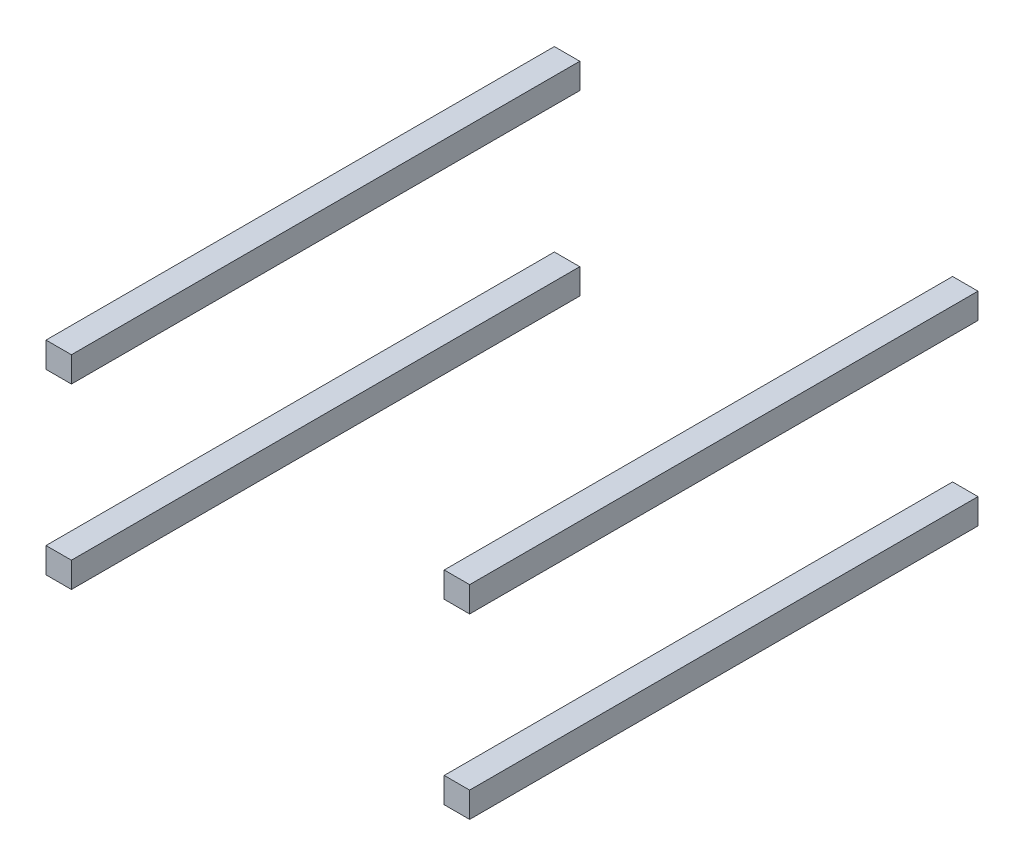
ISO-10303-21;
HEADER;
FILE_DESCRIPTION(('STEP AP214'),'2;1');
FILE_NAME('part.step','',(''),(''),'','','');
FILE_SCHEMA(('AUTOMOTIVE_DESIGN { 1 0 10303 214 1 1 1 1 }'));
ENDSEC;
DATA;
#1=APPLICATION_CONTEXT('core data for automotive mechanical design processes');
#2=APPLICATION_PROTOCOL_DEFINITION('international standard','automotive_design',2000,#1);
#3=PRODUCT_CONTEXT('',#1,'mechanical');
#4=PRODUCT('Part','Part','',(#3));
#5=PRODUCT_RELATED_PRODUCT_CATEGORY('part','',(#4));
#6=PRODUCT_DEFINITION_FORMATION('','',#4);
#7=PRODUCT_DEFINITION_CONTEXT('part definition',#1,'design');
#8=PRODUCT_DEFINITION('design','',#6,#7);
#9=PRODUCT_DEFINITION_SHAPE('','',#8);
#10=(LENGTH_UNIT() NAMED_UNIT(*) SI_UNIT(.MILLI.,.METRE.));
#11=(NAMED_UNIT(*) PLANE_ANGLE_UNIT() SI_UNIT($,.RADIAN.));
#12=(NAMED_UNIT(*) SI_UNIT($,.STERADIAN.) SOLID_ANGLE_UNIT());
#13=UNCERTAINTY_MEASURE_WITH_UNIT(LENGTH_MEASURE(1.E-05),#10,'distance_accuracy_value','');
#14=(GEOMETRIC_REPRESENTATION_CONTEXT(3) GLOBAL_UNCERTAINTY_ASSIGNED_CONTEXT((#13)) GLOBAL_UNIT_ASSIGNED_CONTEXT((#10,
#11,#12)) REPRESENTATION_CONTEXT('',''));
#15=CARTESIAN_POINT('',(0.,0.,0.));
#16=DIRECTION('',(0.,0.,1.));
#17=DIRECTION('',(1.,0.,0.));
#18=AXIS2_PLACEMENT_3D('',#15,#16,#17);
#19=CARTESIAN_POINT('',(-447.698412698413,45.5807916395078,600.));
#20=DIRECTION('',(1.,0.,0.));
#21=DIRECTION('',(0.,0.,-1.));
#22=AXIS2_PLACEMENT_3D('',#19,#20,#21);
#23=PLANE('',#22);
#24=DIRECTION('',(0.,-1.,0.));
#25=VECTOR('',#24,1.);
#26=CARTESIAN_POINT('',(-447.698412698413,45.5807916395078,0.));
#27=LINE('',#26,#25);
#28=CARTESIAN_POINT('',(-447.698412698413,45.5807916395078,0.));
#29=VERTEX_POINT('',#28);
#30=CARTESIAN_POINT('',(-447.698412698413,15.5807916395078,0.));
#31=VERTEX_POINT('',#30);
#32=EDGE_CURVE('E12',#29,#31,#27,.T.);
#33=ORIENTED_EDGE('',*,*,#32,.T.);
#34=DIRECTION('',(0.,0.,-1.));
#35=VECTOR('',#34,1.);
#36=CARTESIAN_POINT('',(-447.698412698413,15.5807916395078,600.));
#37=LINE('',#36,#35);
#38=CARTESIAN_POINT('',(-447.698412698413,15.5807916395078,600.));
#39=VERTEX_POINT('',#38);
#40=EDGE_CURVE('E136',#39,#31,#37,.T.);
#41=ORIENTED_EDGE('',*,*,#40,.F.);
#42=DIRECTION('',(0.,-1.,0.));
#43=VECTOR('',#42,1.);
#44=CARTESIAN_POINT('',(-447.698412698413,45.5807916395078,600.));
#45=LINE('',#44,#43);
#46=CARTESIAN_POINT('',(-447.698412698413,45.5807916395078,600.));
#47=VERTEX_POINT('',#46);
#48=EDGE_CURVE('E58',#47,#39,#45,.T.);
#49=ORIENTED_EDGE('',*,*,#48,.F.);
#50=DIRECTION('',(0.,0.,-1.));
#51=VECTOR('',#50,1.);
#52=CARTESIAN_POINT('',(-447.698412698413,45.5807916395078,600.));
#53=LINE('',#52,#51);
#54=EDGE_CURVE('E99',#47,#29,#53,.T.);
#55=ORIENTED_EDGE('',*,*,#54,.T.);
#56=EDGE_LOOP('',(#33,#41,#49,#55));
#57=FACE_BOUND('',#56,.T.);
#58=ADVANCED_FACE('F54',(#57),#23,.F.);
#59=CARTESIAN_POINT('',(-447.698412698413,15.5807916395078,600.));
#60=DIRECTION('',(0.,1.,0.));
#61=DIRECTION('',(-1.,0.,0.));
#62=AXIS2_PLACEMENT_3D('',#59,#60,#61);
#63=PLANE('',#62);
#64=DIRECTION('',(1.,0.,0.));
#65=VECTOR('',#64,1.);
#66=CARTESIAN_POINT('',(-447.698412698413,15.5807916395078,0.));
#67=LINE('',#66,#65);
#68=CARTESIAN_POINT('',(-417.698412698413,15.5807916395079,0.));
#69=VERTEX_POINT('',#68);
#70=EDGE_CURVE('E65',#31,#69,#67,.T.);
#71=ORIENTED_EDGE('',*,*,#70,.T.);
#72=DIRECTION('',(0.,0.,-1.));
#73=VECTOR('',#72,1.);
#74=CARTESIAN_POINT('',(-417.698412698413,15.5807916395079,600.));
#75=LINE('',#74,#73);
#76=CARTESIAN_POINT('',(-417.698412698413,15.5807916395079,600.));
#77=VERTEX_POINT('',#76);
#78=EDGE_CURVE('E114',#77,#69,#75,.T.);
#79=ORIENTED_EDGE('',*,*,#78,.F.);
#80=DIRECTION('',(1.,0.,0.));
#81=VECTOR('',#80,1.);
#82=CARTESIAN_POINT('',(-447.698412698413,15.5807916395078,600.));
#83=LINE('',#82,#81);
#84=EDGE_CURVE('E91',#39,#77,#83,.T.);
#85=ORIENTED_EDGE('',*,*,#84,.F.);
#86=ORIENTED_EDGE('',*,*,#40,.T.);
#87=EDGE_LOOP('',(#71,#79,#85,#86));
#88=FACE_BOUND('',#87,.T.);
#89=ADVANCED_FACE('F140',(#88),#63,.F.);
#90=CARTESIAN_POINT('',(-417.698412698413,45.5807916395079,600.));
#91=DIRECTION('',(1.,0.,0.));
#92=DIRECTION('',(0.,0.,-1.));
#93=AXIS2_PLACEMENT_3D('',#90,#91,#92);
#94=PLANE('',#93);
#95=DIRECTION('',(0.,-1.,0.));
#96=VECTOR('',#95,1.);
#97=CARTESIAN_POINT('',(-417.698412698413,45.5807916395079,0.));
#98=LINE('',#97,#96);
#99=CARTESIAN_POINT('',(-417.698412698413,45.5807916395079,0.));
#100=VERTEX_POINT('',#99);
#101=EDGE_CURVE('E116',#100,#69,#98,.T.);
#102=ORIENTED_EDGE('',*,*,#101,.F.);
#103=DIRECTION('',(0.,0.,-1.));
#104=VECTOR('',#103,1.);
#105=CARTESIAN_POINT('',(-417.698412698413,45.5807916395079,600.));
#106=LINE('',#105,#104);
#107=CARTESIAN_POINT('',(-417.698412698413,45.5807916395079,600.));
#108=VERTEX_POINT('',#107);
#109=EDGE_CURVE('E104',#108,#100,#106,.T.);
#110=ORIENTED_EDGE('',*,*,#109,.F.);
#111=DIRECTION('',(0.,-1.,0.));
#112=VECTOR('',#111,1.);
#113=CARTESIAN_POINT('',(-417.698412698413,45.5807916395079,600.));
#114=LINE('',#113,#112);
#115=EDGE_CURVE('E130',#108,#77,#114,.T.);
#116=ORIENTED_EDGE('',*,*,#115,.T.);
#117=ORIENTED_EDGE('',*,*,#78,.T.);
#118=EDGE_LOOP('',(#102,#110,#116,#117));
#119=FACE_BOUND('',#118,.T.);
#120=ADVANCED_FACE('F117',(#119),#94,.T.);
#121=CARTESIAN_POINT('',(-447.698412698413,45.5807916395078,600.));
#122=DIRECTION('',(0.,1.,0.));
#123=DIRECTION('',(-1.,0.,0.));
#124=AXIS2_PLACEMENT_3D('',#121,#122,#123);
#125=PLANE('',#124);
#126=DIRECTION('',(1.,0.,0.));
#127=VECTOR('',#126,1.);
#128=CARTESIAN_POINT('',(-447.698412698413,45.5807916395078,0.));
#129=LINE('',#128,#127);
#130=EDGE_CURVE('E108',#29,#100,#129,.T.);
#131=ORIENTED_EDGE('',*,*,#130,.F.);
#132=ORIENTED_EDGE('',*,*,#54,.F.);
#133=DIRECTION('',(1.,0.,0.));
#134=VECTOR('',#133,1.);
#135=CARTESIAN_POINT('',(-447.698412698413,45.5807916395078,600.));
#136=LINE('',#135,#134);
#137=EDGE_CURVE('E110',#47,#108,#136,.T.);
#138=ORIENTED_EDGE('',*,*,#137,.T.);
#139=ORIENTED_EDGE('',*,*,#109,.T.);
#140=EDGE_LOOP('',(#131,#132,#138,#139));
#141=FACE_BOUND('',#140,.T.);
#142=ADVANCED_FACE('F106',(#141),#125,.T.);
#143=CARTESIAN_POINT('',(0.,0.,600.));
#144=DIRECTION('',(0.,0.,1.));
#145=DIRECTION('',(1.,0.,0.));
#146=AXIS2_PLACEMENT_3D('',#143,#144,#145);
#147=PLANE('',#146);
#148=ORIENTED_EDGE('',*,*,#48,.T.);
#149=ORIENTED_EDGE('',*,*,#84,.T.);
#150=ORIENTED_EDGE('',*,*,#115,.F.);
#151=ORIENTED_EDGE('',*,*,#137,.F.);
#152=EDGE_LOOP('',(#148,#149,#150,#151));
#153=FACE_BOUND('',#152,.T.);
#154=ADVANCED_FACE('F56',(#153),#147,.T.);
#155=CARTESIAN_POINT('',(0.,0.,0.));
#156=DIRECTION('',(0.,0.,1.));
#157=DIRECTION('',(1.,0.,0.));
#158=AXIS2_PLACEMENT_3D('',#155,#156,#157);
#159=PLANE('',#158);
#160=ORIENTED_EDGE('',*,*,#32,.F.);
#161=ORIENTED_EDGE('',*,*,#130,.T.);
#162=ORIENTED_EDGE('',*,*,#101,.T.);
#163=ORIENTED_EDGE('',*,*,#70,.F.);
#164=EDGE_LOOP('',(#160,#161,#162,#163));
#165=FACE_BOUND('',#164,.T.);
#166=ADVANCED_FACE('F120',(#165),#159,.F.);
#167=CLOSED_SHELL('',(#58,#89,#120,#142,#154,#166));
#168=MANIFOLD_SOLID_BREP('B2',#167);
#169=CARTESIAN_POINT('',(22.3015873015873,45.5807916395078,600.));
#170=DIRECTION('',(1.,0.,0.));
#171=DIRECTION('',(0.,1.,0.));
#172=AXIS2_PLACEMENT_3D('',#169,#170,#171);
#173=PLANE('',#172);
#174=DIRECTION('',(0.,-1.,0.));
#175=VECTOR('',#174,1.);
#176=CARTESIAN_POINT('',(22.3015873015873,45.5807916395078,0.));
#177=LINE('',#176,#175);
#178=CARTESIAN_POINT('',(22.3015873015873,45.5807916395078,0.));
#179=VERTEX_POINT('',#178);
#180=CARTESIAN_POINT('',(22.3015873015873,15.580791639508,0.));
#181=VERTEX_POINT('',#180);
#182=EDGE_CURVE('E52',#179,#181,#177,.T.);
#183=ORIENTED_EDGE('',*,*,#182,.T.);
#184=DIRECTION('',(0.,0.,-1.));
#185=VECTOR('',#184,1.);
#186=CARTESIAN_POINT('',(22.3015873015873,15.580791639508,600.));
#187=LINE('',#186,#185);
#188=CARTESIAN_POINT('',(22.3015873015873,15.580791639508,600.));
#189=VERTEX_POINT('',#188);
#190=EDGE_CURVE('E283',#189,#181,#187,.T.);
#191=ORIENTED_EDGE('',*,*,#190,.F.);
#192=DIRECTION('',(0.,-1.,0.));
#193=VECTOR('',#192,1.);
#194=CARTESIAN_POINT('',(22.3015873015873,45.5807916395078,600.));
#195=LINE('',#194,#193);
#196=CARTESIAN_POINT('',(22.3015873015873,45.5807916395078,600.));
#197=VERTEX_POINT('',#196);
#198=EDGE_CURVE('E216',#197,#189,#195,.T.);
#199=ORIENTED_EDGE('',*,*,#198,.F.);
#200=DIRECTION('',(0.,0.,-1.));
#201=VECTOR('',#200,1.);
#202=CARTESIAN_POINT('',(22.3015873015873,45.5807916395078,600.));
#203=LINE('',#202,#201);
#204=EDGE_CURVE('E256',#197,#179,#203,.T.);
#205=ORIENTED_EDGE('',*,*,#204,.T.);
#206=EDGE_LOOP('',(#183,#191,#199,#205));
#207=FACE_BOUND('',#206,.T.);
#208=ADVANCED_FACE('F212',(#207),#173,.F.);
#209=CARTESIAN_POINT('',(22.3015873015873,15.580791639508,600.));
#210=DIRECTION('',(0.,1.,0.));
#211=DIRECTION('',(-1.,0.,0.));
#212=AXIS2_PLACEMENT_3D('',#209,#210,#211);
#213=PLANE('',#212);
#214=DIRECTION('',(1.,0.,0.));
#215=VECTOR('',#214,1.);
#216=CARTESIAN_POINT('',(22.3015873015873,15.580791639508,0.));
#217=LINE('',#216,#215);
#218=CARTESIAN_POINT('',(52.3015873015873,15.580791639508,0.));
#219=VERTEX_POINT('',#218);
#220=EDGE_CURVE('E222',#181,#219,#217,.T.);
#221=ORIENTED_EDGE('',*,*,#220,.T.);
#222=DIRECTION('',(0.,0.,-1.));
#223=VECTOR('',#222,1.);
#224=CARTESIAN_POINT('',(52.3015873015873,15.580791639508,600.));
#225=LINE('',#224,#223);
#226=CARTESIAN_POINT('',(52.3015873015873,15.580791639508,600.));
#227=VERTEX_POINT('',#226);
#228=EDGE_CURVE('E270',#227,#219,#225,.T.);
#229=ORIENTED_EDGE('',*,*,#228,.F.);
#230=DIRECTION('',(1.,0.,0.));
#231=VECTOR('',#230,1.);
#232=CARTESIAN_POINT('',(22.3015873015873,15.580791639508,600.));
#233=LINE('',#232,#231);
#234=EDGE_CURVE('E248',#189,#227,#233,.T.);
#235=ORIENTED_EDGE('',*,*,#234,.F.);
#236=ORIENTED_EDGE('',*,*,#190,.T.);
#237=EDGE_LOOP('',(#221,#229,#235,#236));
#238=FACE_BOUND('',#237,.T.);
#239=ADVANCED_FACE('F286',(#238),#213,.F.);
#240=CARTESIAN_POINT('',(52.3015873015873,45.5807916395078,600.));
#241=DIRECTION('',(1.,0.,0.));
#242=DIRECTION('',(0.,1.,0.));
#243=AXIS2_PLACEMENT_3D('',#240,#241,#242);
#244=PLANE('',#243);
#245=DIRECTION('',(0.,-1.,0.));
#246=VECTOR('',#245,1.);
#247=CARTESIAN_POINT('',(52.3015873015873,45.5807916395078,0.));
#248=LINE('',#247,#246);
#249=CARTESIAN_POINT('',(52.3015873015873,45.5807916395078,0.));
#250=VERTEX_POINT('',#249);
#251=EDGE_CURVE('E272',#250,#219,#248,.T.);
#252=ORIENTED_EDGE('',*,*,#251,.F.);
#253=DIRECTION('',(0.,0.,-1.));
#254=VECTOR('',#253,1.);
#255=CARTESIAN_POINT('',(52.3015873015873,45.5807916395078,600.));
#256=LINE('',#255,#254);
#257=CARTESIAN_POINT('',(52.3015873015873,45.5807916395078,600.));
#258=VERTEX_POINT('',#257);
#259=EDGE_CURVE('E261',#258,#250,#256,.T.);
#260=ORIENTED_EDGE('',*,*,#259,.F.);
#261=DIRECTION('',(0.,-1.,0.));
#262=VECTOR('',#261,1.);
#263=CARTESIAN_POINT('',(52.3015873015873,45.5807916395078,600.));
#264=LINE('',#263,#262);
#265=EDGE_CURVE('E281',#258,#227,#264,.T.);
#266=ORIENTED_EDGE('',*,*,#265,.T.);
#267=ORIENTED_EDGE('',*,*,#228,.T.);
#268=EDGE_LOOP('',(#252,#260,#266,#267));
#269=FACE_BOUND('',#268,.T.);
#270=ADVANCED_FACE('F273',(#269),#244,.T.);
#271=CARTESIAN_POINT('',(22.3015873015873,45.5807916395078,600.));
#272=DIRECTION('',(0.,1.,0.));
#273=DIRECTION('',(0.,0.,1.));
#274=AXIS2_PLACEMENT_3D('',#271,#272,#273);
#275=PLANE('',#274);
#276=DIRECTION('',(1.,0.,0.));
#277=VECTOR('',#276,1.);
#278=CARTESIAN_POINT('',(22.3015873015873,45.5807916395078,0.));
#279=LINE('',#278,#277);
#280=EDGE_CURVE('E265',#179,#250,#279,.T.);
#281=ORIENTED_EDGE('',*,*,#280,.F.);
#282=ORIENTED_EDGE('',*,*,#204,.F.);
#283=DIRECTION('',(1.,0.,0.));
#284=VECTOR('',#283,1.);
#285=CARTESIAN_POINT('',(22.3015873015873,45.5807916395078,600.));
#286=LINE('',#285,#284);
#287=EDGE_CURVE('E267',#197,#258,#286,.T.);
#288=ORIENTED_EDGE('',*,*,#287,.T.);
#289=ORIENTED_EDGE('',*,*,#259,.T.);
#290=EDGE_LOOP('',(#281,#282,#288,#289));
#291=FACE_BOUND('',#290,.T.);
#292=ADVANCED_FACE('F263',(#291),#275,.T.);
#293=CARTESIAN_POINT('',(0.,0.,600.));
#294=DIRECTION('',(0.,0.,1.));
#295=DIRECTION('',(1.,0.,0.));
#296=AXIS2_PLACEMENT_3D('',#293,#294,#295);
#297=PLANE('',#296);
#298=ORIENTED_EDGE('',*,*,#198,.T.);
#299=ORIENTED_EDGE('',*,*,#234,.T.);
#300=ORIENTED_EDGE('',*,*,#265,.F.);
#301=ORIENTED_EDGE('',*,*,#287,.F.);
#302=EDGE_LOOP('',(#298,#299,#300,#301));
#303=FACE_BOUND('',#302,.T.);
#304=ADVANCED_FACE('F214',(#303),#297,.T.);
#305=CARTESIAN_POINT('',(0.,0.,0.));
#306=DIRECTION('',(0.,0.,1.));
#307=DIRECTION('',(1.,0.,0.));
#308=AXIS2_PLACEMENT_3D('',#305,#306,#307);
#309=PLANE('',#308);
#310=ORIENTED_EDGE('',*,*,#182,.F.);
#311=ORIENTED_EDGE('',*,*,#280,.T.);
#312=ORIENTED_EDGE('',*,*,#251,.T.);
#313=ORIENTED_EDGE('',*,*,#220,.F.);
#314=EDGE_LOOP('',(#310,#311,#312,#313));
#315=FACE_BOUND('',#314,.T.);
#316=ADVANCED_FACE('F275',(#315),#309,.F.);
#317=CLOSED_SHELL('',(#208,#239,#270,#292,#304,#316));
#318=MANIFOLD_SOLID_BREP('B6',#317);
#319=CARTESIAN_POINT('',(22.3015873015874,-164.419208360492,600.));
#320=DIRECTION('',(1.,0.,0.));
#321=DIRECTION('',(0.,0.,-1.));
#322=AXIS2_PLACEMENT_3D('',#319,#320,#321);
#323=PLANE('',#322);
#324=DIRECTION('',(0.,-1.,0.));
#325=VECTOR('',#324,1.);
#326=CARTESIAN_POINT('',(22.3015873015874,-164.419208360492,0.));
#327=LINE('',#326,#325);
#328=CARTESIAN_POINT('',(22.3015873015874,-164.419208360492,0.));
#329=VERTEX_POINT('',#328);
#330=CARTESIAN_POINT('',(22.3015873015874,-194.419208360492,0.));
#331=VERTEX_POINT('',#330);
#332=EDGE_CURVE('E210',#329,#331,#327,.T.);
#333=ORIENTED_EDGE('',*,*,#332,.T.);
#334=DIRECTION('',(0.,0.,-1.));
#335=VECTOR('',#334,1.);
#336=CARTESIAN_POINT('',(22.3015873015874,-194.419208360492,600.));
#337=LINE('',#336,#335);
#338=CARTESIAN_POINT('',(22.3015873015874,-194.419208360492,600.));
#339=VERTEX_POINT('',#338);
#340=EDGE_CURVE('E428',#339,#331,#337,.T.);
#341=ORIENTED_EDGE('',*,*,#340,.F.);
#342=DIRECTION('',(0.,-1.,0.));
#343=VECTOR('',#342,1.);
#344=CARTESIAN_POINT('',(22.3015873015874,-164.419208360492,600.));
#345=LINE('',#344,#343);
#346=CARTESIAN_POINT('',(22.3015873015874,-164.419208360492,600.));
#347=VERTEX_POINT('',#346);
#348=EDGE_CURVE('E361',#347,#339,#345,.T.);
#349=ORIENTED_EDGE('',*,*,#348,.F.);
#350=DIRECTION('',(0.,0.,-1.));
#351=VECTOR('',#350,1.);
#352=CARTESIAN_POINT('',(22.3015873015874,-164.419208360492,600.));
#353=LINE('',#352,#351);
#354=EDGE_CURVE('E401',#347,#329,#353,.T.);
#355=ORIENTED_EDGE('',*,*,#354,.T.);
#356=EDGE_LOOP('',(#333,#341,#349,#355));
#357=FACE_BOUND('',#356,.T.);
#358=ADVANCED_FACE('F357',(#357),#323,.F.);
#359=CARTESIAN_POINT('',(22.3015873015874,-194.419208360492,600.));
#360=DIRECTION('',(0.,1.,0.));
#361=DIRECTION('',(0.,0.,1.));
#362=AXIS2_PLACEMENT_3D('',#359,#360,#361);
#363=PLANE('',#362);
#364=DIRECTION('',(1.,0.,0.));
#365=VECTOR('',#364,1.);
#366=CARTESIAN_POINT('',(22.3015873015874,-194.419208360492,0.));
#367=LINE('',#366,#365);
#368=CARTESIAN_POINT('',(52.3015873015873,-194.419208360492,0.));
#369=VERTEX_POINT('',#368);
#370=EDGE_CURVE('E367',#331,#369,#367,.T.);
#371=ORIENTED_EDGE('',*,*,#370,.T.);
#372=DIRECTION('',(0.,0.,-1.));
#373=VECTOR('',#372,1.);
#374=CARTESIAN_POINT('',(52.3015873015873,-194.419208360492,600.));
#375=LINE('',#374,#373);
#376=CARTESIAN_POINT('',(52.3015873015873,-194.419208360492,600.));
#377=VERTEX_POINT('',#376);
#378=EDGE_CURVE('E415',#377,#369,#375,.T.);
#379=ORIENTED_EDGE('',*,*,#378,.F.);
#380=DIRECTION('',(1.,0.,0.));
#381=VECTOR('',#380,1.);
#382=CARTESIAN_POINT('',(22.3015873015874,-194.419208360492,600.));
#383=LINE('',#382,#381);
#384=EDGE_CURVE('E393',#339,#377,#383,.T.);
#385=ORIENTED_EDGE('',*,*,#384,.F.);
#386=ORIENTED_EDGE('',*,*,#340,.T.);
#387=EDGE_LOOP('',(#371,#379,#385,#386));
#388=FACE_BOUND('',#387,.T.);
#389=ADVANCED_FACE('F431',(#388),#363,.F.);
#390=CARTESIAN_POINT('',(52.3015873015873,-164.419208360492,600.));
#391=DIRECTION('',(1.,0.,0.));
#392=DIRECTION('',(0.,0.,-1.));
#393=AXIS2_PLACEMENT_3D('',#390,#391,#392);
#394=PLANE('',#393);
#395=DIRECTION('',(0.,-1.,0.));
#396=VECTOR('',#395,1.);
#397=CARTESIAN_POINT('',(52.3015873015873,-164.419208360492,0.));
#398=LINE('',#397,#396);
#399=CARTESIAN_POINT('',(52.3015873015873,-164.419208360492,0.));
#400=VERTEX_POINT('',#399);
#401=EDGE_CURVE('E417',#400,#369,#398,.T.);
#402=ORIENTED_EDGE('',*,*,#401,.F.);
#403=DIRECTION('',(0.,0.,-1.));
#404=VECTOR('',#403,1.);
#405=CARTESIAN_POINT('',(52.3015873015873,-164.419208360492,600.));
#406=LINE('',#405,#404);
#407=CARTESIAN_POINT('',(52.3015873015873,-164.419208360492,600.));
#408=VERTEX_POINT('',#407);
#409=EDGE_CURVE('E406',#408,#400,#406,.T.);
#410=ORIENTED_EDGE('',*,*,#409,.F.);
#411=DIRECTION('',(0.,-1.,0.));
#412=VECTOR('',#411,1.);
#413=CARTESIAN_POINT('',(52.3015873015873,-164.419208360492,600.));
#414=LINE('',#413,#412);
#415=EDGE_CURVE('E426',#408,#377,#414,.T.);
#416=ORIENTED_EDGE('',*,*,#415,.T.);
#417=ORIENTED_EDGE('',*,*,#378,.T.);
#418=EDGE_LOOP('',(#402,#410,#416,#417));
#419=FACE_BOUND('',#418,.T.);
#420=ADVANCED_FACE('F418',(#419),#394,.T.);
#421=CARTESIAN_POINT('',(22.3015873015874,-164.419208360492,600.));
#422=DIRECTION('',(0.,1.,0.));
#423=DIRECTION('',(-1.,0.,0.));
#424=AXIS2_PLACEMENT_3D('',#421,#422,#423);
#425=PLANE('',#424);
#426=DIRECTION('',(1.,0.,0.));
#427=VECTOR('',#426,1.);
#428=CARTESIAN_POINT('',(22.3015873015874,-164.419208360492,0.));
#429=LINE('',#428,#427);
#430=EDGE_CURVE('E410',#329,#400,#429,.T.);
#431=ORIENTED_EDGE('',*,*,#430,.F.);
#432=ORIENTED_EDGE('',*,*,#354,.F.);
#433=DIRECTION('',(1.,0.,0.));
#434=VECTOR('',#433,1.);
#435=CARTESIAN_POINT('',(22.3015873015874,-164.419208360492,600.));
#436=LINE('',#435,#434);
#437=EDGE_CURVE('E412',#347,#408,#436,.T.);
#438=ORIENTED_EDGE('',*,*,#437,.T.);
#439=ORIENTED_EDGE('',*,*,#409,.T.);
#440=EDGE_LOOP('',(#431,#432,#438,#439));
#441=FACE_BOUND('',#440,.T.);
#442=ADVANCED_FACE('F408',(#441),#425,.T.);
#443=CARTESIAN_POINT('',(0.,0.,600.));
#444=DIRECTION('',(0.,0.,1.));
#445=DIRECTION('',(1.,0.,0.));
#446=AXIS2_PLACEMENT_3D('',#443,#444,#445);
#447=PLANE('',#446);
#448=ORIENTED_EDGE('',*,*,#348,.T.);
#449=ORIENTED_EDGE('',*,*,#384,.T.);
#450=ORIENTED_EDGE('',*,*,#415,.F.);
#451=ORIENTED_EDGE('',*,*,#437,.F.);
#452=EDGE_LOOP('',(#448,#449,#450,#451));
#453=FACE_BOUND('',#452,.T.);
#454=ADVANCED_FACE('F359',(#453),#447,.T.);
#455=CARTESIAN_POINT('',(0.,0.,0.));
#456=DIRECTION('',(0.,0.,1.));
#457=DIRECTION('',(1.,0.,0.));
#458=AXIS2_PLACEMENT_3D('',#455,#456,#457);
#459=PLANE('',#458);
#460=ORIENTED_EDGE('',*,*,#332,.F.);
#461=ORIENTED_EDGE('',*,*,#430,.T.);
#462=ORIENTED_EDGE('',*,*,#401,.T.);
#463=ORIENTED_EDGE('',*,*,#370,.F.);
#464=EDGE_LOOP('',(#460,#461,#462,#463));
#465=FACE_BOUND('',#464,.T.);
#466=ADVANCED_FACE('F420',(#465),#459,.F.);
#467=CLOSED_SHELL('',(#358,#389,#420,#442,#454,#466));
#468=MANIFOLD_SOLID_BREP('B46',#467);
#469=CARTESIAN_POINT('',(-447.698412698413,-164.419208360492,600.));
#470=DIRECTION('',(1.,0.,0.));
#471=DIRECTION('',(0.,1.,0.));
#472=AXIS2_PLACEMENT_3D('',#469,#470,#471);
#473=PLANE('',#472);
#474=DIRECTION('',(0.,-1.,0.));
#475=VECTOR('',#474,1.);
#476=CARTESIAN_POINT('',(-447.698412698413,-164.419208360492,0.));
#477=LINE('',#476,#475);
#478=CARTESIAN_POINT('',(-447.698412698413,-164.419208360492,0.));
#479=VERTEX_POINT('',#478);
#480=CARTESIAN_POINT('',(-447.698412698413,-194.419208360492,0.));
#481=VERTEX_POINT('',#480);
#482=EDGE_CURVE('E556',#479,#481,#477,.T.);
#483=ORIENTED_EDGE('',*,*,#482,.T.);
#484=DIRECTION('',(0.,0.,-1.));
#485=VECTOR('',#484,1.);
#486=CARTESIAN_POINT('',(-447.698412698413,-194.419208360492,600.));
#487=LINE('',#486,#485);
#488=CARTESIAN_POINT('',(-447.698412698413,-194.419208360492,600.));
#489=VERTEX_POINT('',#488);
#490=EDGE_CURVE('E355',#489,#481,#487,.T.);
#491=ORIENTED_EDGE('',*,*,#490,.F.);
#492=DIRECTION('',(0.,-1.,0.));
#493=VECTOR('',#492,1.);
#494=CARTESIAN_POINT('',(-447.698412698413,-164.419208360492,600.));
#495=LINE('',#494,#493);
#496=CARTESIAN_POINT('',(-447.698412698413,-164.419208360492,600.));
#497=VERTEX_POINT('',#496);
#498=EDGE_CURVE('E542',#497,#489,#495,.T.);
#499=ORIENTED_EDGE('',*,*,#498,.F.);
#500=DIRECTION('',(0.,0.,-1.));
#501=VECTOR('',#500,1.);
#502=CARTESIAN_POINT('',(-447.698412698413,-164.419208360492,600.));
#503=LINE('',#502,#501);
#504=EDGE_CURVE('E509',#497,#479,#503,.T.);
#505=ORIENTED_EDGE('',*,*,#504,.T.);
#506=EDGE_LOOP('',(#483,#491,#499,#505));
#507=FACE_BOUND('',#506,.T.);
#508=ADVANCED_FACE('F493',(#507),#473,.F.);
#509=CARTESIAN_POINT('',(-447.698412698413,-194.419208360492,600.));
#510=DIRECTION('',(0.,1.,0.));
#511=DIRECTION('',(0.,0.,1.));
#512=AXIS2_PLACEMENT_3D('',#509,#510,#511);
#513=PLANE('',#512);
#514=DIRECTION('',(1.,0.,0.));
#515=VECTOR('',#514,1.);
#516=CARTESIAN_POINT('',(-447.698412698413,-194.419208360492,0.));
#517=LINE('',#516,#515);
#518=CARTESIAN_POINT('',(-417.698412698413,-194.419208360492,0.));
#519=VERTEX_POINT('',#518);
#520=EDGE_CURVE('E547',#481,#519,#517,.T.);
#521=ORIENTED_EDGE('',*,*,#520,.T.);
#522=DIRECTION('',(0.,0.,-1.));
#523=VECTOR('',#522,1.);
#524=CARTESIAN_POINT('',(-417.698412698413,-194.419208360492,600.));
#525=LINE('',#524,#523);
#526=CARTESIAN_POINT('',(-417.698412698413,-194.419208360492,600.));
#527=VERTEX_POINT('',#526);
#528=EDGE_CURVE('E501',#527,#519,#525,.T.);
#529=ORIENTED_EDGE('',*,*,#528,.F.);
#530=DIRECTION('',(1.,0.,0.));
#531=VECTOR('',#530,1.);
#532=CARTESIAN_POINT('',(-447.698412698413,-194.419208360492,600.));
#533=LINE('',#532,#531);
#534=EDGE_CURVE('E534',#489,#527,#533,.T.);
#535=ORIENTED_EDGE('',*,*,#534,.F.);
#536=ORIENTED_EDGE('',*,*,#490,.T.);
#537=EDGE_LOOP('',(#521,#529,#535,#536));
#538=FACE_BOUND('',#537,.T.);
#539=ADVANCED_FACE('F546',(#538),#513,.F.);
#540=CARTESIAN_POINT('',(-417.698412698413,-164.419208360492,600.));
#541=DIRECTION('',(1.,0.,0.));
#542=DIRECTION('',(0.,0.,-1.));
#543=AXIS2_PLACEMENT_3D('',#540,#541,#542);
#544=PLANE('',#543);
#545=DIRECTION('',(0.,-1.,0.));
#546=VECTOR('',#545,1.);
#547=CARTESIAN_POINT('',(-417.698412698413,-164.419208360492,0.));
#548=LINE('',#547,#546);
#549=CARTESIAN_POINT('',(-417.698412698413,-164.419208360492,0.));
#550=VERTEX_POINT('',#549);
#551=EDGE_CURVE('E559',#550,#519,#548,.T.);
#552=ORIENTED_EDGE('',*,*,#551,.F.);
#553=DIRECTION('',(0.,0.,-1.));
#554=VECTOR('',#553,1.);
#555=CARTESIAN_POINT('',(-417.698412698413,-164.419208360492,600.));
#556=LINE('',#555,#554);
#557=CARTESIAN_POINT('',(-417.698412698413,-164.419208360492,600.));
#558=VERTEX_POINT('',#557);
#559=EDGE_CURVE('E523',#558,#550,#556,.T.);
#560=ORIENTED_EDGE('',*,*,#559,.F.);
#561=DIRECTION('',(0.,-1.,0.));
#562=VECTOR('',#561,1.);
#563=CARTESIAN_POINT('',(-417.698412698413,-164.419208360492,600.));
#564=LINE('',#563,#562);
#565=EDGE_CURVE('E541',#558,#527,#564,.T.);
#566=ORIENTED_EDGE('',*,*,#565,.T.);
#567=ORIENTED_EDGE('',*,*,#528,.T.);
#568=EDGE_LOOP('',(#552,#560,#566,#567));
#569=FACE_BOUND('',#568,.T.);
#570=ADVANCED_FACE('F550',(#569),#544,.T.);
#571=CARTESIAN_POINT('',(-447.698412698413,-164.419208360492,600.));
#572=DIRECTION('',(0.,1.,0.));
#573=DIRECTION('',(-1.,0.,0.));
#574=AXIS2_PLACEMENT_3D('',#571,#572,#573);
#575=PLANE('',#574);
#576=DIRECTION('',(1.,0.,0.));
#577=VECTOR('',#576,1.);
#578=CARTESIAN_POINT('',(-447.698412698413,-164.419208360492,0.));
#579=LINE('',#578,#577);
#580=EDGE_CURVE('E561',#479,#550,#579,.T.);
#581=ORIENTED_EDGE('',*,*,#580,.F.);
#582=ORIENTED_EDGE('',*,*,#504,.F.);
#583=DIRECTION('',(1.,0.,0.));
#584=VECTOR('',#583,1.);
#585=CARTESIAN_POINT('',(-447.698412698413,-164.419208360492,600.));
#586=LINE('',#585,#584);
#587=EDGE_CURVE('E551',#497,#558,#586,.T.);
#588=ORIENTED_EDGE('',*,*,#587,.T.);
#589=ORIENTED_EDGE('',*,*,#559,.T.);
#590=EDGE_LOOP('',(#581,#582,#588,#589));
#591=FACE_BOUND('',#590,.T.);
#592=ADVANCED_FACE('F567',(#591),#575,.T.);
#593=CARTESIAN_POINT('',(0.,0.,600.));
#594=DIRECTION('',(0.,0.,1.));
#595=DIRECTION('',(1.,0.,0.));
#596=AXIS2_PLACEMENT_3D('',#593,#594,#595);
#597=PLANE('',#596);
#598=ORIENTED_EDGE('',*,*,#498,.T.);
#599=ORIENTED_EDGE('',*,*,#534,.T.);
#600=ORIENTED_EDGE('',*,*,#565,.F.);
#601=ORIENTED_EDGE('',*,*,#587,.F.);
#602=EDGE_LOOP('',(#598,#599,#600,#601));
#603=FACE_BOUND('',#602,.T.);
#604=ADVANCED_FACE('F538',(#603),#597,.T.);
#605=CARTESIAN_POINT('',(0.,0.,0.));
#606=DIRECTION('',(0.,0.,1.));
#607=DIRECTION('',(1.,0.,0.));
#608=AXIS2_PLACEMENT_3D('',#605,#606,#607);
#609=PLANE('',#608);
#610=ORIENTED_EDGE('',*,*,#482,.F.);
#611=ORIENTED_EDGE('',*,*,#580,.T.);
#612=ORIENTED_EDGE('',*,*,#551,.T.);
#613=ORIENTED_EDGE('',*,*,#520,.F.);
#614=EDGE_LOOP('',(#610,#611,#612,#613));
#615=FACE_BOUND('',#614,.T.);
#616=ADVANCED_FACE('F566',(#615),#609,.F.);
#617=CLOSED_SHELL('',(#508,#539,#570,#592,#604,#616));
#618=MANIFOLD_SOLID_BREP('B204',#617);
#619=ADVANCED_BREP_SHAPE_REPRESENTATION('',(#18,#168,#318,#468,#618),#14);
#620=SHAPE_DEFINITION_REPRESENTATION(#9,#619);
ENDSEC;
END-ISO-10303-21;
